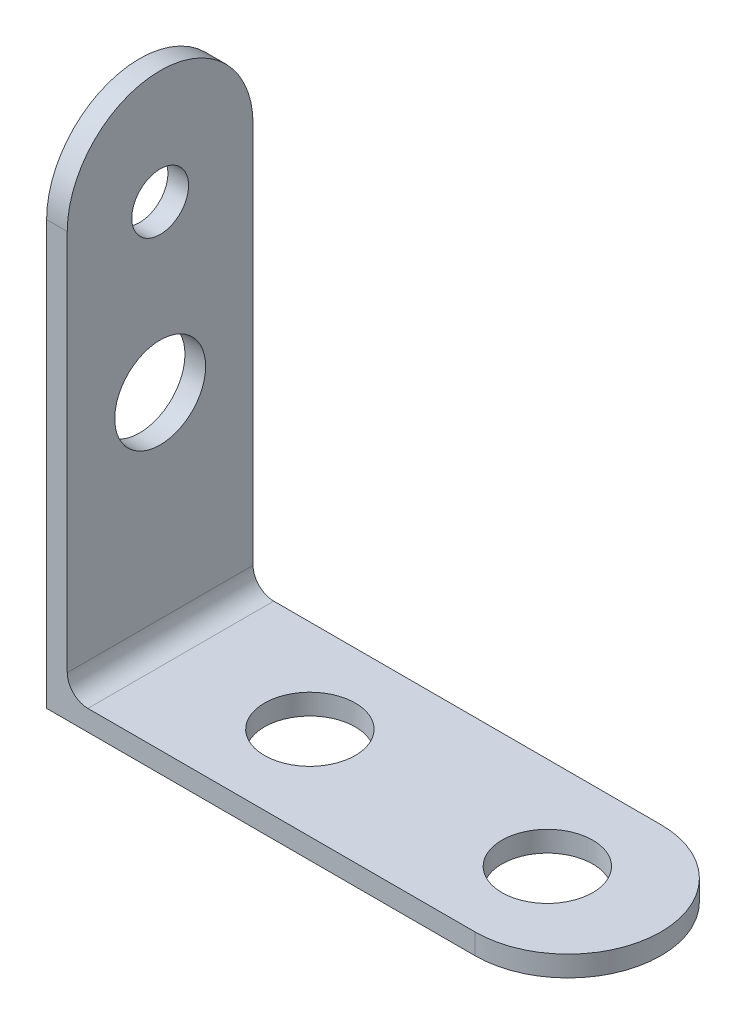
ISO-10303-21;
HEADER;
FILE_DESCRIPTION(('STEP AP214'),'2;1');
FILE_NAME('part.step','',(''),(''),'','','');
FILE_SCHEMA(('AUTOMOTIVE_DESIGN { 1 0 10303 214 1 1 1 1 }'));
ENDSEC;
DATA;
#1=APPLICATION_CONTEXT('core data for automotive mechanical design processes');
#2=APPLICATION_PROTOCOL_DEFINITION('international standard','automotive_design',2000,#1);
#3=PRODUCT_CONTEXT('',#1,'mechanical');
#4=PRODUCT('Part','Part','',(#3));
#5=PRODUCT_RELATED_PRODUCT_CATEGORY('part','',(#4));
#6=PRODUCT_DEFINITION_FORMATION('','',#4);
#7=PRODUCT_DEFINITION_CONTEXT('part definition',#1,'design');
#8=PRODUCT_DEFINITION('design','',#6,#7);
#9=PRODUCT_DEFINITION_SHAPE('','',#8);
#10=(LENGTH_UNIT() NAMED_UNIT(*) SI_UNIT(.MILLI.,.METRE.));
#11=(NAMED_UNIT(*) PLANE_ANGLE_UNIT() SI_UNIT($,.RADIAN.));
#12=(NAMED_UNIT(*) SI_UNIT($,.STERADIAN.) SOLID_ANGLE_UNIT());
#13=UNCERTAINTY_MEASURE_WITH_UNIT(LENGTH_MEASURE(1.E-05),#10,'distance_accuracy_value','');
#14=(GEOMETRIC_REPRESENTATION_CONTEXT(3) GLOBAL_UNCERTAINTY_ASSIGNED_CONTEXT((#13)) GLOBAL_UNIT_ASSIGNED_CONTEXT((#10,
#11,#12)) REPRESENTATION_CONTEXT('',''));
#15=CARTESIAN_POINT('',(0.,0.,0.));
#16=DIRECTION('',(0.,0.,1.));
#17=DIRECTION('',(1.,0.,0.));
#18=AXIS2_PLACEMENT_3D('',#15,#16,#17);
#19=CARTESIAN_POINT('',(0.,0.,18.));
#20=DIRECTION('',(0.,-1.,0.));
#21=DIRECTION('',(1.,0.,0.));
#22=AXIS2_PLACEMENT_3D('',#19,#20,#21);
#23=PLANE('',#22);
#24=CARTESIAN_POINT('',(-34.,0.,9.));
#25=DIRECTION('',(0.,1.,0.));
#26=DIRECTION('',(0.,0.,1.));
#27=AXIS2_PLACEMENT_3D('',#24,#25,#26);
#28=CIRCLE('',#27,4.4);
#29=CARTESIAN_POINT('',(-34.,0.,13.4));
#30=VERTEX_POINT('',#29);
#31=EDGE_CURVE('E254',#30,#30,#28,.T.);
#32=ORIENTED_EDGE('',*,*,#31,.F.);
#33=EDGE_LOOP('',(#32));
#34=FACE_BOUND('',#33,.T.);
#35=CARTESIAN_POINT('',(-11.,0.,9.));
#36=DIRECTION('',(0.,1.,0.));
#37=DIRECTION('',(0.,0.,1.));
#38=AXIS2_PLACEMENT_3D('',#35,#36,#37);
#39=CIRCLE('',#38,4.4);
#40=CARTESIAN_POINT('',(-11.,0.,13.4));
#41=VERTEX_POINT('',#40);
#42=EDGE_CURVE('E263',#41,#41,#39,.T.);
#43=ORIENTED_EDGE('',*,*,#42,.F.);
#44=EDGE_LOOP('',(#43));
#45=FACE_BOUND('',#44,.T.);
#46=DIRECTION('',(-1.,0.,0.));
#47=VECTOR('',#46,1.);
#48=CARTESIAN_POINT('',(0.,0.,18.));
#49=LINE('',#48,#47);
#50=CARTESIAN_POINT('',(-9.,0.,18.));
#51=VERTEX_POINT('',#50);
#52=CARTESIAN_POINT('',(-46.5,0.,18.));
#53=VERTEX_POINT('',#52);
#54=EDGE_CURVE('E135',#51,#53,#49,.T.);
#55=ORIENTED_EDGE('',*,*,#54,.F.);
#56=CARTESIAN_POINT('',(-9.,0.,9.));
#57=DIRECTION('',(0.,1.,0.));
#58=DIRECTION('',(0.,0.,1.));
#59=AXIS2_PLACEMENT_3D('',#56,#57,#58);
#60=CIRCLE('',#59,9.);
#61=CARTESIAN_POINT('',(-9.,0.,0.));
#62=VERTEX_POINT('',#61);
#63=EDGE_CURVE('E171',#62,#51,#60,.F.);
#64=ORIENTED_EDGE('',*,*,#63,.F.);
#65=DIRECTION('',(-1.,0.,0.));
#66=VECTOR('',#65,1.);
#67=CARTESIAN_POINT('',(0.,0.,0.));
#68=LINE('',#67,#66);
#69=CARTESIAN_POINT('',(-46.5,0.,0.));
#70=VERTEX_POINT('',#69);
#71=EDGE_CURVE('E212',#62,#70,#68,.T.);
#72=ORIENTED_EDGE('',*,*,#71,.T.);
#73=DIRECTION('',(0.,0.,-1.));
#74=VECTOR('',#73,1.);
#75=CARTESIAN_POINT('',(-46.5,0.,18.));
#76=LINE('',#75,#74);
#77=EDGE_CURVE('E187',#70,#53,#76,.F.);
#78=ORIENTED_EDGE('',*,*,#77,.T.);
#79=EDGE_LOOP('',(#55,#64,#72,#78));
#80=FACE_BOUND('',#79,.T.);
#81=ADVANCED_FACE('F110',(#34,#45,#80),#23,.F.);
#82=CARTESIAN_POINT('',(-50.5,-2.,18.));
#83=DIRECTION('',(0.,1.,0.));
#84=DIRECTION('',(-1.,0.,0.));
#85=AXIS2_PLACEMENT_3D('',#82,#83,#84);
#86=PLANE('',#85);
#87=CARTESIAN_POINT('',(-34.,-2.,9.));
#88=DIRECTION('',(0.,1.,0.));
#89=DIRECTION('',(-1.,0.,0.));
#90=AXIS2_PLACEMENT_3D('',#87,#88,#89);
#91=CIRCLE('',#90,4.4);
#92=CARTESIAN_POINT('',(-38.4,-2.,9.));
#93=VERTEX_POINT('',#92);
#94=EDGE_CURVE('E114',#93,#93,#91,.T.);
#95=ORIENTED_EDGE('',*,*,#94,.T.);
#96=EDGE_LOOP('',(#95));
#97=FACE_BOUND('',#96,.T.);
#98=CARTESIAN_POINT('',(-11.,-2.00000000000001,9.));
#99=DIRECTION('',(0.,1.,0.));
#100=DIRECTION('',(-1.,0.,0.));
#101=AXIS2_PLACEMENT_3D('',#98,#99,#100);
#102=CIRCLE('',#101,4.4);
#103=CARTESIAN_POINT('',(-15.4,-2.,9.));
#104=VERTEX_POINT('',#103);
#105=EDGE_CURVE('E251',#104,#104,#102,.T.);
#106=ORIENTED_EDGE('',*,*,#105,.T.);
#107=EDGE_LOOP('',(#106));
#108=FACE_BOUND('',#107,.T.);
#109=CARTESIAN_POINT('',(-9.,-2.00000000000001,9.));
#110=DIRECTION('',(0.,1.,0.));
#111=DIRECTION('',(-1.,0.,0.));
#112=AXIS2_PLACEMENT_3D('',#109,#110,#111);
#113=CIRCLE('',#112,9.);
#114=CARTESIAN_POINT('',(-9.,-2.,0.));
#115=VERTEX_POINT('',#114);
#116=CARTESIAN_POINT('',(-9.,-2.,18.));
#117=VERTEX_POINT('',#116);
#118=EDGE_CURVE('E12',#115,#117,#113,.F.);
#119=ORIENTED_EDGE('',*,*,#118,.T.);
#120=DIRECTION('',(1.,0.,0.));
#121=VECTOR('',#120,1.);
#122=CARTESIAN_POINT('',(-50.5,-2.,18.));
#123=LINE('',#122,#121);
#124=CARTESIAN_POINT('',(-50.5,-2.,18.));
#125=VERTEX_POINT('',#124);
#126=EDGE_CURVE('E183',#125,#117,#123,.T.);
#127=ORIENTED_EDGE('',*,*,#126,.F.);
#128=DIRECTION('',(0.,0.,-1.));
#129=VECTOR('',#128,1.);
#130=CARTESIAN_POINT('',(-50.5,-2.,18.));
#131=LINE('',#130,#129);
#132=CARTESIAN_POINT('',(-50.5,-2.,0.));
#133=VERTEX_POINT('',#132);
#134=EDGE_CURVE('E211',#125,#133,#131,.T.);
#135=ORIENTED_EDGE('',*,*,#134,.T.);
#136=DIRECTION('',(1.,0.,0.));
#137=VECTOR('',#136,1.);
#138=CARTESIAN_POINT('',(-50.5,-2.,0.));
#139=LINE('',#138,#137);
#140=EDGE_CURVE('E191',#133,#115,#139,.T.);
#141=ORIENTED_EDGE('',*,*,#140,.T.);
#142=EDGE_LOOP('',(#119,#127,#135,#141));
#143=FACE_BOUND('',#142,.T.);
#144=ADVANCED_FACE('F294',(#97,#108,#143),#86,.F.);
#145=CARTESIAN_POINT('',(-48.5,0.,18.));
#146=DIRECTION('',(-1.,0.,0.));
#147=DIRECTION('',(0.,0.,1.));
#148=AXIS2_PLACEMENT_3D('',#145,#146,#147);
#149=PLANE('',#148);
#150=CARTESIAN_POINT('',(-48.5,21.,9.));
#151=DIRECTION('',(1.,0.,0.));
#152=DIRECTION('',(0.,0.,-1.));
#153=AXIS2_PLACEMENT_3D('',#150,#151,#152);
#154=CIRCLE('',#153,4.4);
#155=CARTESIAN_POINT('',(-48.5,21.,4.6));
#156=VERTEX_POINT('',#155);
#157=EDGE_CURVE('E275',#156,#156,#154,.T.);
#158=ORIENTED_EDGE('',*,*,#157,.F.);
#159=EDGE_LOOP('',(#158));
#160=FACE_BOUND('',#159,.T.);
#161=CARTESIAN_POINT('',(-48.5,37.,9.));
#162=DIRECTION('',(1.,0.,0.));
#163=DIRECTION('',(0.,0.,-1.));
#164=AXIS2_PLACEMENT_3D('',#161,#162,#163);
#165=CIRCLE('',#164,2.75);
#166=CARTESIAN_POINT('',(-48.5,37.,6.25));
#167=VERTEX_POINT('',#166);
#168=EDGE_CURVE('E279',#167,#167,#165,.T.);
#169=ORIENTED_EDGE('',*,*,#168,.F.);
#170=EDGE_LOOP('',(#169));
#171=FACE_BOUND('',#170,.T.);
#172=CARTESIAN_POINT('',(-48.5,39.,9.));
#173=DIRECTION('',(1.,0.,0.));
#174=DIRECTION('',(0.,0.,-1.));
#175=AXIS2_PLACEMENT_3D('',#172,#173,#174);
#176=CIRCLE('',#175,9.);
#177=CARTESIAN_POINT('',(-48.5,39.,18.));
#178=VERTEX_POINT('',#177);
#179=CARTESIAN_POINT('',(-48.5,39.,0.));
#180=VERTEX_POINT('',#179);
#181=EDGE_CURVE('E127',#178,#180,#176,.F.);
#182=ORIENTED_EDGE('',*,*,#181,.F.);
#183=DIRECTION('',(0.,1.,0.));
#184=VECTOR('',#183,1.);
#185=CARTESIAN_POINT('',(-48.5,0.,18.));
#186=LINE('',#185,#184);
#187=CARTESIAN_POINT('',(-48.5,1.99999999999999,18.));
#188=VERTEX_POINT('',#187);
#189=EDGE_CURVE('E190',#188,#178,#186,.T.);
#190=ORIENTED_EDGE('',*,*,#189,.F.);
#191=DIRECTION('',(0.,0.,-1.));
#192=VECTOR('',#191,1.);
#193=CARTESIAN_POINT('',(-48.5,1.99999999999999,0.));
#194=LINE('',#193,#192);
#195=CARTESIAN_POINT('',(-48.5,1.99999999999999,0.));
#196=VERTEX_POINT('',#195);
#197=EDGE_CURVE('E225',#188,#196,#194,.T.);
#198=ORIENTED_EDGE('',*,*,#197,.T.);
#199=DIRECTION('',(0.,1.,0.));
#200=VECTOR('',#199,1.);
#201=CARTESIAN_POINT('',(-48.5,0.,0.));
#202=LINE('',#201,#200);
#203=EDGE_CURVE('E215',#196,#180,#202,.T.);
#204=ORIENTED_EDGE('',*,*,#203,.T.);
#205=EDGE_LOOP('',(#182,#190,#198,#204));
#206=FACE_BOUND('',#205,.T.);
#207=ADVANCED_FACE('F290',(#160,#171,#206),#149,.F.);
#208=CARTESIAN_POINT('',(-50.5,48.,18.));
#209=DIRECTION('',(1.,0.,0.));
#210=DIRECTION('',(0.,1.,0.));
#211=AXIS2_PLACEMENT_3D('',#208,#209,#210);
#212=PLANE('',#211);
#213=CARTESIAN_POINT('',(-50.5,21.,9.));
#214=DIRECTION('',(1.,0.,0.));
#215=DIRECTION('',(0.,1.,0.));
#216=AXIS2_PLACEMENT_3D('',#213,#214,#215);
#217=CIRCLE('',#216,4.4);
#218=CARTESIAN_POINT('',(-50.5,25.4,9.));
#219=VERTEX_POINT('',#218);
#220=EDGE_CURVE('E216',#219,#219,#217,.T.);
#221=ORIENTED_EDGE('',*,*,#220,.T.);
#222=EDGE_LOOP('',(#221));
#223=FACE_BOUND('',#222,.T.);
#224=CARTESIAN_POINT('',(-50.5,37.,9.));
#225=DIRECTION('',(1.,0.,0.));
#226=DIRECTION('',(0.,1.,0.));
#227=AXIS2_PLACEMENT_3D('',#224,#225,#226);
#228=CIRCLE('',#227,2.75);
#229=CARTESIAN_POINT('',(-50.5,39.75,9.));
#230=VERTEX_POINT('',#229);
#231=EDGE_CURVE('E241',#230,#230,#228,.T.);
#232=ORIENTED_EDGE('',*,*,#231,.T.);
#233=EDGE_LOOP('',(#232));
#234=FACE_BOUND('',#233,.T.);
#235=DIRECTION('',(0.,-1.,0.));
#236=VECTOR('',#235,1.);
#237=CARTESIAN_POINT('',(-50.5,48.,18.));
#238=LINE('',#237,#236);
#239=CARTESIAN_POINT('',(-50.5,39.,18.));
#240=VERTEX_POINT('',#239);
#241=EDGE_CURVE('E198',#240,#125,#238,.T.);
#242=ORIENTED_EDGE('',*,*,#241,.F.);
#243=CARTESIAN_POINT('',(-50.5,39.,9.));
#244=DIRECTION('',(1.,0.,0.));
#245=DIRECTION('',(0.,1.,0.));
#246=AXIS2_PLACEMENT_3D('',#243,#244,#245);
#247=CIRCLE('',#246,9.);
#248=CARTESIAN_POINT('',(-50.5,39.,0.));
#249=VERTEX_POINT('',#248);
#250=EDGE_CURVE('E204',#240,#249,#247,.F.);
#251=ORIENTED_EDGE('',*,*,#250,.T.);
#252=DIRECTION('',(0.,-1.,0.));
#253=VECTOR('',#252,1.);
#254=CARTESIAN_POINT('',(-50.5,48.,0.));
#255=LINE('',#254,#253);
#256=EDGE_CURVE('E201',#249,#133,#255,.T.);
#257=ORIENTED_EDGE('',*,*,#256,.T.);
#258=ORIENTED_EDGE('',*,*,#134,.F.);
#259=EDGE_LOOP('',(#242,#251,#257,#258));
#260=FACE_BOUND('',#259,.T.);
#261=ADVANCED_FACE('F293',(#223,#234,#260),#212,.F.);
#262=CARTESIAN_POINT('',(0.,0.,18.));
#263=DIRECTION('',(0.,0.,1.));
#264=DIRECTION('',(1.,0.,0.));
#265=AXIS2_PLACEMENT_3D('',#262,#263,#264);
#266=PLANE('',#265);
#267=DIRECTION('',(0.,1.,0.));
#268=VECTOR('',#267,1.);
#269=CARTESIAN_POINT('',(-9.,-10.,18.));
#270=LINE('',#269,#268);
#271=EDGE_CURVE('E173',#117,#51,#270,.T.);
#272=ORIENTED_EDGE('',*,*,#271,.T.);
#273=ORIENTED_EDGE('',*,*,#54,.T.);
#274=CARTESIAN_POINT('',(-46.5,1.99999999999999,18.));
#275=DIRECTION('',(0.,0.,1.));
#276=DIRECTION('',(1.,0.,0.));
#277=AXIS2_PLACEMENT_3D('',#274,#275,#276);
#278=CIRCLE('',#277,2.);
#279=EDGE_CURVE('E235',#53,#188,#278,.F.);
#280=ORIENTED_EDGE('',*,*,#279,.T.);
#281=ORIENTED_EDGE('',*,*,#189,.T.);
#282=DIRECTION('',(1.,0.,0.));
#283=VECTOR('',#282,1.);
#284=CARTESIAN_POINT('',(-58.5,39.,18.));
#285=LINE('',#284,#283);
#286=EDGE_CURVE('E120',#178,#240,#285,.F.);
#287=ORIENTED_EDGE('',*,*,#286,.T.);
#288=ORIENTED_EDGE('',*,*,#241,.T.);
#289=ORIENTED_EDGE('',*,*,#126,.T.);
#290=EDGE_LOOP('',(#272,#273,#280,#281,#287,#288,#289));
#291=FACE_BOUND('',#290,.T.);
#292=ADVANCED_FACE('F181',(#291),#266,.T.);
#293=CARTESIAN_POINT('',(0.,0.,0.));
#294=DIRECTION('',(0.,0.,1.));
#295=DIRECTION('',(1.,0.,0.));
#296=AXIS2_PLACEMENT_3D('',#293,#294,#295);
#297=PLANE('',#296);
#298=ORIENTED_EDGE('',*,*,#71,.F.);
#299=DIRECTION('',(0.,1.,0.));
#300=VECTOR('',#299,1.);
#301=CARTESIAN_POINT('',(-9.,-10.,0.));
#302=LINE('',#301,#300);
#303=EDGE_CURVE('E176',#115,#62,#302,.T.);
#304=ORIENTED_EDGE('',*,*,#303,.F.);
#305=ORIENTED_EDGE('',*,*,#140,.F.);
#306=ORIENTED_EDGE('',*,*,#256,.F.);
#307=DIRECTION('',(1.,0.,0.));
#308=VECTOR('',#307,1.);
#309=CARTESIAN_POINT('',(-58.5,39.,0.));
#310=LINE('',#309,#308);
#311=EDGE_CURVE('E238',#180,#249,#310,.F.);
#312=ORIENTED_EDGE('',*,*,#311,.F.);
#313=ORIENTED_EDGE('',*,*,#203,.F.);
#314=CARTESIAN_POINT('',(-46.5,1.99999999999999,0.));
#315=DIRECTION('',(0.,0.,1.));
#316=DIRECTION('',(1.,0.,0.));
#317=AXIS2_PLACEMENT_3D('',#314,#315,#316);
#318=CIRCLE('',#317,2.);
#319=EDGE_CURVE('E231',#196,#70,#318,.T.);
#320=ORIENTED_EDGE('',*,*,#319,.T.);
#321=EDGE_LOOP('',(#298,#304,#305,#306,#312,#313,#320));
#322=FACE_BOUND('',#321,.T.);
#323=ADVANCED_FACE('F305',(#322),#297,.F.);
#324=CARTESIAN_POINT('',(-46.5,1.99999999999999,18.));
#325=DIRECTION('',(0.,0.,1.));
#326=DIRECTION('',(1.,0.,0.));
#327=AXIS2_PLACEMENT_3D('',#324,#325,#326);
#328=CYLINDRICAL_SURFACE('',#327,2.);
#329=ORIENTED_EDGE('',*,*,#279,.F.);
#330=ORIENTED_EDGE('',*,*,#77,.F.);
#331=ORIENTED_EDGE('',*,*,#319,.F.);
#332=ORIENTED_EDGE('',*,*,#197,.F.);
#333=EDGE_LOOP('',(#329,#330,#331,#332));
#334=FACE_BOUND('',#333,.T.);
#335=ADVANCED_FACE('F112',(#334),#328,.F.);
#336=CARTESIAN_POINT('',(-58.5,39.,9.));
#337=DIRECTION('',(1.,0.,0.));
#338=DIRECTION('',(0.,0.,-1.));
#339=AXIS2_PLACEMENT_3D('',#336,#337,#338);
#340=CYLINDRICAL_SURFACE('',#339,9.);
#341=ORIENTED_EDGE('',*,*,#250,.F.);
#342=ORIENTED_EDGE('',*,*,#286,.F.);
#343=ORIENTED_EDGE('',*,*,#181,.T.);
#344=ORIENTED_EDGE('',*,*,#311,.T.);
#345=EDGE_LOOP('',(#341,#342,#343,#344));
#346=FACE_BOUND('',#345,.T.);
#347=ADVANCED_FACE('F300',(#346),#340,.T.);
#348=CARTESIAN_POINT('',(-58.5,37.,9.));
#349=DIRECTION('',(1.,0.,0.));
#350=DIRECTION('',(0.,0.,-1.));
#351=AXIS2_PLACEMENT_3D('',#348,#349,#350);
#352=CYLINDRICAL_SURFACE('',#351,2.75);
#353=ORIENTED_EDGE('',*,*,#168,.T.);
#354=EDGE_LOOP('',(#353));
#355=FACE_BOUND('',#354,.T.);
#356=ORIENTED_EDGE('',*,*,#231,.F.);
#357=EDGE_LOOP('',(#356));
#358=FACE_BOUND('',#357,.T.);
#359=ADVANCED_FACE('F287',(#355,#358),#352,.F.);
#360=CARTESIAN_POINT('',(-58.5,21.,9.));
#361=DIRECTION('',(1.,0.,0.));
#362=DIRECTION('',(0.,0.,-1.));
#363=AXIS2_PLACEMENT_3D('',#360,#361,#362);
#364=CYLINDRICAL_SURFACE('',#363,4.4);
#365=ORIENTED_EDGE('',*,*,#157,.T.);
#366=EDGE_LOOP('',(#365));
#367=FACE_BOUND('',#366,.T.);
#368=ORIENTED_EDGE('',*,*,#220,.F.);
#369=EDGE_LOOP('',(#368));
#370=FACE_BOUND('',#369,.T.);
#371=ADVANCED_FACE('F381',(#367,#370),#364,.F.);
#372=CARTESIAN_POINT('',(-11.,-10.,9.));
#373=DIRECTION('',(0.,1.,0.));
#374=DIRECTION('',(0.,0.,1.));
#375=AXIS2_PLACEMENT_3D('',#372,#373,#374);
#376=CYLINDRICAL_SURFACE('',#375,4.4);
#377=ORIENTED_EDGE('',*,*,#42,.T.);
#378=EDGE_LOOP('',(#377));
#379=FACE_BOUND('',#378,.T.);
#380=ORIENTED_EDGE('',*,*,#105,.F.);
#381=EDGE_LOOP('',(#380));
#382=FACE_BOUND('',#381,.T.);
#383=ADVANCED_FACE('F387',(#379,#382),#376,.F.);
#384=CARTESIAN_POINT('',(-9.,-10.,9.));
#385=DIRECTION('',(0.,1.,0.));
#386=DIRECTION('',(0.,0.,1.));
#387=AXIS2_PLACEMENT_3D('',#384,#385,#386);
#388=CYLINDRICAL_SURFACE('',#387,9.);
#389=ORIENTED_EDGE('',*,*,#303,.T.);
#390=ORIENTED_EDGE('',*,*,#63,.T.);
#391=ORIENTED_EDGE('',*,*,#271,.F.);
#392=ORIENTED_EDGE('',*,*,#118,.F.);
#393=EDGE_LOOP('',(#389,#390,#391,#392));
#394=FACE_BOUND('',#393,.T.);
#395=ADVANCED_FACE('F172',(#394),#388,.T.);
#396=CARTESIAN_POINT('',(-34.,-10.,9.));
#397=DIRECTION('',(0.,1.,0.));
#398=DIRECTION('',(0.,0.,1.));
#399=AXIS2_PLACEMENT_3D('',#396,#397,#398);
#400=CYLINDRICAL_SURFACE('',#399,4.4);
#401=ORIENTED_EDGE('',*,*,#31,.T.);
#402=EDGE_LOOP('',(#401));
#403=FACE_BOUND('',#402,.T.);
#404=ORIENTED_EDGE('',*,*,#94,.F.);
#405=EDGE_LOOP('',(#404));
#406=FACE_BOUND('',#405,.T.);
#407=ADVANCED_FACE('F397',(#403,#406),#400,.F.);
#408=CLOSED_SHELL('',(#81,#144,#207,#261,#292,#323,#335,#347,#359,#371,#383,#395,#407));
#409=MANIFOLD_SOLID_BREP('B2',#408);
#410=ADVANCED_BREP_SHAPE_REPRESENTATION('',(#18,#409),#14);
#411=SHAPE_DEFINITION_REPRESENTATION(#9,#410);
ENDSEC;
END-ISO-10303-21;
